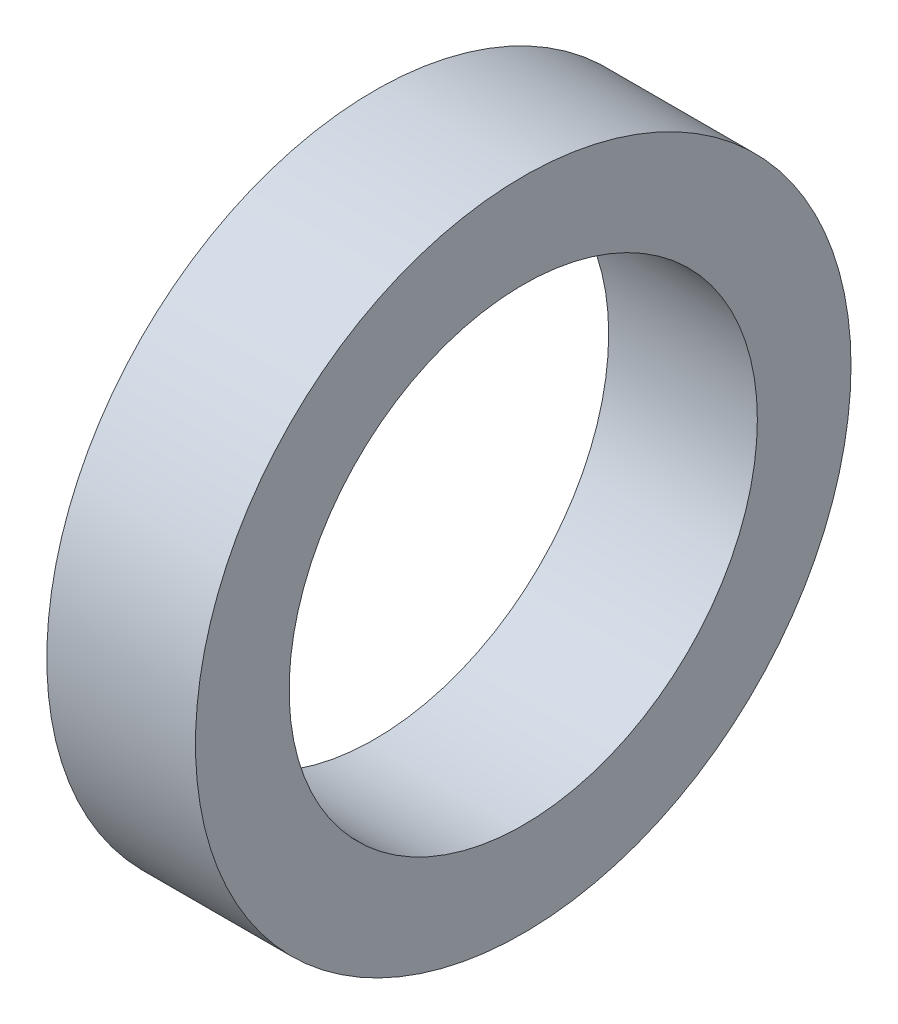
ISO-10303-21;
HEADER;
FILE_DESCRIPTION(('STEP AP214'),'2;1');
FILE_NAME('part.step','',(''),(''),'','','');
FILE_SCHEMA(('AUTOMOTIVE_DESIGN { 1 0 10303 214 1 1 1 1 }'));
ENDSEC;
DATA;
#1=APPLICATION_CONTEXT('core data for automotive mechanical design processes');
#2=APPLICATION_PROTOCOL_DEFINITION('international standard','automotive_design',2000,#1);
#3=PRODUCT_CONTEXT('',#1,'mechanical');
#4=PRODUCT('Part','Part','',(#3));
#5=PRODUCT_RELATED_PRODUCT_CATEGORY('part','',(#4));
#6=PRODUCT_DEFINITION_FORMATION('','',#4);
#7=PRODUCT_DEFINITION_CONTEXT('part definition',#1,'design');
#8=PRODUCT_DEFINITION('design','',#6,#7);
#9=PRODUCT_DEFINITION_SHAPE('','',#8);
#10=(LENGTH_UNIT() NAMED_UNIT(*) SI_UNIT(.MILLI.,.METRE.));
#11=(NAMED_UNIT(*) PLANE_ANGLE_UNIT() SI_UNIT($,.RADIAN.));
#12=(NAMED_UNIT(*) SI_UNIT($,.STERADIAN.) SOLID_ANGLE_UNIT());
#13=UNCERTAINTY_MEASURE_WITH_UNIT(LENGTH_MEASURE(1.E-05),#10,'distance_accuracy_value','');
#14=(GEOMETRIC_REPRESENTATION_CONTEXT(3) GLOBAL_UNCERTAINTY_ASSIGNED_CONTEXT((#13)) GLOBAL_UNIT_ASSIGNED_CONTEXT((#10,
#11,#12)) REPRESENTATION_CONTEXT('',''));
#15=CARTESIAN_POINT('',(0.,0.,0.));
#16=DIRECTION('',(0.,0.,1.));
#17=DIRECTION('',(1.,0.,0.));
#18=AXIS2_PLACEMENT_3D('',#15,#16,#17);
#19=CARTESIAN_POINT('',(1.5875,0.,0.));
#20=DIRECTION('',(1.,0.,0.));
#21=DIRECTION('',(0.,0.,-1.));
#22=AXIS2_PLACEMENT_3D('',#19,#20,#21);
#23=PLANE('',#22);
#24=CARTESIAN_POINT('',(1.5875,0.,0.));
#25=DIRECTION('',(1.,0.,0.));
#26=DIRECTION('',(0.,0.,-1.));
#27=AXIS2_PLACEMENT_3D('',#24,#25,#26);
#28=CIRCLE('',#27,3.5);
#29=CARTESIAN_POINT('',(1.5875,0.,-3.5));
#30=VERTEX_POINT('',#29);
#31=EDGE_CURVE('E10',#30,#30,#28,.T.);
#32=ORIENTED_EDGE('',*,*,#31,.T.);
#33=EDGE_LOOP('',(#32));
#34=FACE_BOUND('',#33,.T.);
#35=CARTESIAN_POINT('',(1.5875,0.,0.));
#36=DIRECTION('',(1.,0.,0.));
#37=DIRECTION('',(0.,0.,-1.));
#38=AXIS2_PLACEMENT_3D('',#35,#36,#37);
#39=CIRCLE('',#38,2.5);
#40=CARTESIAN_POINT('',(1.5875,0.,-2.5));
#41=VERTEX_POINT('',#40);
#42=EDGE_CURVE('E41',#41,#41,#39,.T.);
#43=ORIENTED_EDGE('',*,*,#42,.F.);
#44=EDGE_LOOP('',(#43));
#45=FACE_BOUND('',#44,.T.);
#46=ADVANCED_FACE('F30',(#34,#45),#23,.T.);
#47=CARTESIAN_POINT('',(0.,0.,0.));
#48=DIRECTION('',(1.,0.,0.));
#49=DIRECTION('',(0.,0.,-1.));
#50=AXIS2_PLACEMENT_3D('',#47,#48,#49);
#51=PLANE('',#50);
#52=CARTESIAN_POINT('',(0.,0.,0.));
#53=DIRECTION('',(1.,0.,0.));
#54=DIRECTION('',(0.,0.,-1.));
#55=AXIS2_PLACEMENT_3D('',#52,#53,#54);
#56=CIRCLE('',#55,3.5);
#57=CARTESIAN_POINT('',(0.,0.,-3.5));
#58=VERTEX_POINT('',#57);
#59=EDGE_CURVE('E34',#58,#58,#56,.T.);
#60=ORIENTED_EDGE('',*,*,#59,.F.);
#61=EDGE_LOOP('',(#60));
#62=FACE_BOUND('',#61,.T.);
#63=CARTESIAN_POINT('',(0.,0.,0.));
#64=DIRECTION('',(1.,0.,0.));
#65=DIRECTION('',(0.,0.,-1.));
#66=AXIS2_PLACEMENT_3D('',#63,#64,#65);
#67=CIRCLE('',#66,2.5);
#68=CARTESIAN_POINT('',(0.,0.,-2.5));
#69=VERTEX_POINT('',#68);
#70=EDGE_CURVE('E43',#69,#69,#67,.T.);
#71=ORIENTED_EDGE('',*,*,#70,.T.);
#72=EDGE_LOOP('',(#71));
#73=FACE_BOUND('',#72,.T.);
#74=ADVANCED_FACE('F53',(#62,#73),#51,.F.);
#75=CARTESIAN_POINT('',(1.5875,0.,0.));
#76=DIRECTION('',(-1.,0.,0.));
#77=DIRECTION('',(0.,0.,1.));
#78=AXIS2_PLACEMENT_3D('',#75,#76,#77);
#79=CYLINDRICAL_SURFACE('',#78,3.5);
#80=ORIENTED_EDGE('',*,*,#31,.F.);
#81=EDGE_LOOP('',(#80));
#82=FACE_BOUND('',#81,.T.);
#83=ORIENTED_EDGE('',*,*,#59,.T.);
#84=EDGE_LOOP('',(#83));
#85=FACE_BOUND('',#84,.T.);
#86=ADVANCED_FACE('F32',(#82,#85),#79,.T.);
#87=CARTESIAN_POINT('',(1.5875,0.,0.));
#88=DIRECTION('',(-1.,0.,0.));
#89=DIRECTION('',(0.,0.,1.));
#90=AXIS2_PLACEMENT_3D('',#87,#88,#89);
#91=CYLINDRICAL_SURFACE('',#90,2.5);
#92=ORIENTED_EDGE('',*,*,#42,.T.);
#93=EDGE_LOOP('',(#92));
#94=FACE_BOUND('',#93,.T.);
#95=ORIENTED_EDGE('',*,*,#70,.F.);
#96=EDGE_LOOP('',(#95));
#97=FACE_BOUND('',#96,.T.);
#98=ADVANCED_FACE('F49',(#94,#97),#91,.F.);
#99=CLOSED_SHELL('',(#46,#74,#86,#98));
#100=MANIFOLD_SOLID_BREP('B2',#99);
#101=ADVANCED_BREP_SHAPE_REPRESENTATION('',(#18,#100),#14);
#102=SHAPE_DEFINITION_REPRESENTATION(#9,#101);
ENDSEC;
END-ISO-10303-21;
